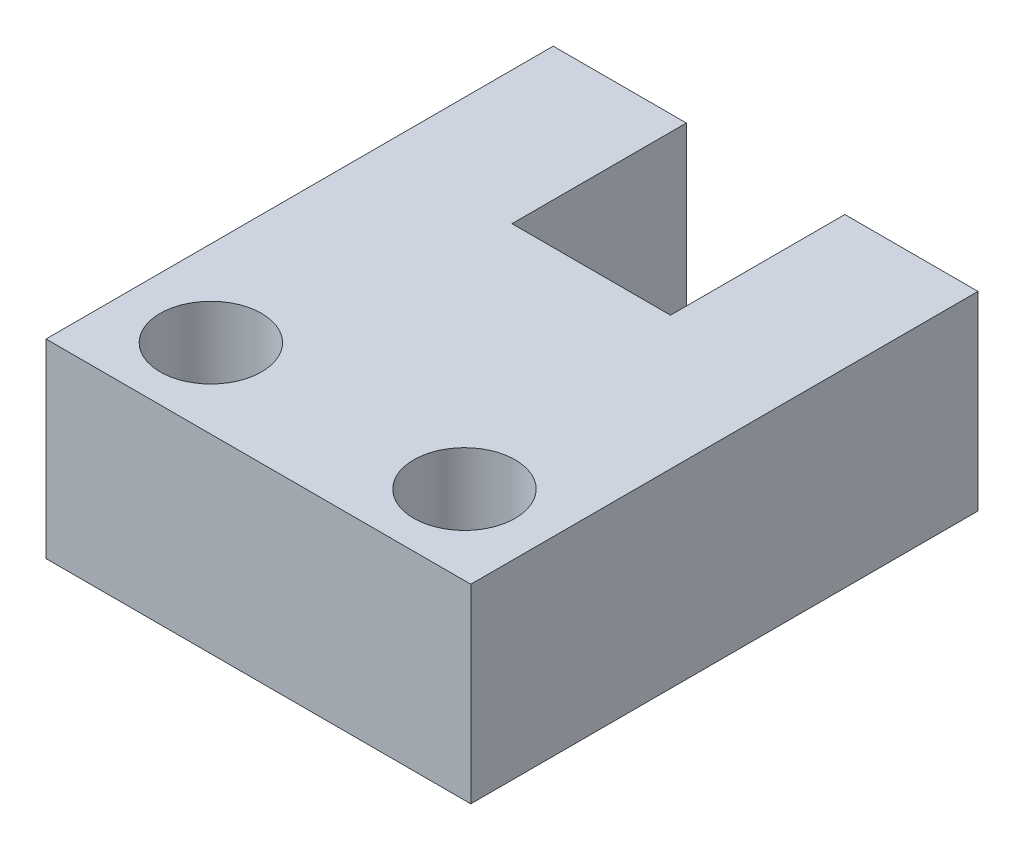
ISO-10303-21;
HEADER;
FILE_DESCRIPTION(('STEP AP214'),'2;1');
FILE_NAME('part.step','',(''),(''),'','','');
FILE_SCHEMA(('AUTOMOTIVE_DESIGN { 1 0 10303 214 1 1 1 1 }'));
ENDSEC;
DATA;
#1=APPLICATION_CONTEXT('core data for automotive mechanical design processes');
#2=APPLICATION_PROTOCOL_DEFINITION('international standard','automotive_design',2000,#1);
#3=PRODUCT_CONTEXT('',#1,'mechanical');
#4=PRODUCT('Part','Part','',(#3));
#5=PRODUCT_RELATED_PRODUCT_CATEGORY('part','',(#4));
#6=PRODUCT_DEFINITION_FORMATION('','',#4);
#7=PRODUCT_DEFINITION_CONTEXT('part definition',#1,'design');
#8=PRODUCT_DEFINITION('design','',#6,#7);
#9=PRODUCT_DEFINITION_SHAPE('','',#8);
#10=(LENGTH_UNIT() NAMED_UNIT(*) SI_UNIT(.MILLI.,.METRE.));
#11=(NAMED_UNIT(*) PLANE_ANGLE_UNIT() SI_UNIT($,.RADIAN.));
#12=(NAMED_UNIT(*) SI_UNIT($,.STERADIAN.) SOLID_ANGLE_UNIT());
#13=UNCERTAINTY_MEASURE_WITH_UNIT(LENGTH_MEASURE(1.E-05),#10,'distance_accuracy_value','');
#14=(GEOMETRIC_REPRESENTATION_CONTEXT(3) GLOBAL_UNCERTAINTY_ASSIGNED_CONTEXT((#13)) GLOBAL_UNIT_ASSIGNED_CONTEXT((#10,
#11,#12)) REPRESENTATION_CONTEXT('',''));
#15=CARTESIAN_POINT('',(0.,0.,0.));
#16=DIRECTION('',(0.,0.,1.));
#17=DIRECTION('',(1.,0.,0.));
#18=AXIS2_PLACEMENT_3D('',#15,#16,#17);
#19=CARTESIAN_POINT('',(0.,6.,0.));
#20=DIRECTION('',(0.,1.,0.));
#21=DIRECTION('',(0.,0.,1.));
#22=AXIS2_PLACEMENT_3D('',#19,#20,#21);
#23=PLANE('',#22);
#24=CARTESIAN_POINT('',(4.,6.,5.49999999999999));
#25=DIRECTION('',(0.,1.,0.));
#26=DIRECTION('',(0.,0.,1.));
#27=AXIS2_PLACEMENT_3D('',#24,#25,#26);
#28=CIRCLE('',#27,1.6);
#29=CARTESIAN_POINT('',(4.,6.,7.09999999999999));
#30=VERTEX_POINT('',#29);
#31=EDGE_CURVE('E140',#30,#30,#28,.T.);
#32=ORIENTED_EDGE('',*,*,#31,.F.);
#33=EDGE_LOOP('',(#32));
#34=FACE_BOUND('',#33,.T.);
#35=DIRECTION('',(0.,0.,-1.));
#36=VECTOR('',#35,1.);
#37=CARTESIAN_POINT('',(6.7,6.,-8.));
#38=LINE('',#37,#36);
#39=CARTESIAN_POINT('',(6.7,6.,8.));
#40=VERTEX_POINT('',#39);
#41=CARTESIAN_POINT('',(6.7,6.,-8.));
#42=VERTEX_POINT('',#41);
#43=EDGE_CURVE('E151',#40,#42,#38,.T.);
#44=ORIENTED_EDGE('',*,*,#43,.T.);
#45=DIRECTION('',(-1.,0.,0.));
#46=VECTOR('',#45,1.);
#47=CARTESIAN_POINT('',(2.5,6.,-8.00000000000001));
#48=LINE('',#47,#46);
#49=CARTESIAN_POINT('',(2.5,6.,-8.00000000000001));
#50=VERTEX_POINT('',#49);
#51=EDGE_CURVE('E99',#42,#50,#48,.T.);
#52=ORIENTED_EDGE('',*,*,#51,.T.);
#53=DIRECTION('',(0.,0.,1.));
#54=VECTOR('',#53,1.);
#55=CARTESIAN_POINT('',(2.5,6.,-8.00000000000001));
#56=LINE('',#55,#54);
#57=CARTESIAN_POINT('',(2.5,6.,-2.50000000000001));
#58=VERTEX_POINT('',#57);
#59=EDGE_CURVE('E166',#50,#58,#56,.T.);
#60=ORIENTED_EDGE('',*,*,#59,.T.);
#61=DIRECTION('',(-1.,0.,0.));
#62=VECTOR('',#61,1.);
#63=CARTESIAN_POINT('',(2.5,6.,-2.50000000000001));
#64=LINE('',#63,#62);
#65=CARTESIAN_POINT('',(-2.5,6.,-2.50000000000001));
#66=VERTEX_POINT('',#65);
#67=EDGE_CURVE('E179',#58,#66,#64,.T.);
#68=ORIENTED_EDGE('',*,*,#67,.T.);
#69=DIRECTION('',(0.,0.,-1.));
#70=VECTOR('',#69,1.);
#71=CARTESIAN_POINT('',(-2.5,6.,-8.00000000000001));
#72=LINE('',#71,#70);
#73=CARTESIAN_POINT('',(-2.5,6.,-8.00000000000001));
#74=VERTEX_POINT('',#73);
#75=EDGE_CURVE('E118',#66,#74,#72,.T.);
#76=ORIENTED_EDGE('',*,*,#75,.T.);
#77=DIRECTION('',(-1.,0.,0.));
#78=VECTOR('',#77,1.);
#79=CARTESIAN_POINT('',(-6.7,6.,-8.));
#80=LINE('',#79,#78);
#81=CARTESIAN_POINT('',(-6.7,6.,-8.));
#82=VERTEX_POINT('',#81);
#83=EDGE_CURVE('E112',#74,#82,#80,.T.);
#84=ORIENTED_EDGE('',*,*,#83,.T.);
#85=DIRECTION('',(0.,0.,1.));
#86=VECTOR('',#85,1.);
#87=CARTESIAN_POINT('',(-6.7,6.,-8.));
#88=LINE('',#87,#86);
#89=CARTESIAN_POINT('',(-6.7,6.,8.));
#90=VERTEX_POINT('',#89);
#91=EDGE_CURVE('E116',#82,#90,#88,.T.);
#92=ORIENTED_EDGE('',*,*,#91,.T.);
#93=DIRECTION('',(1.,0.,0.));
#94=VECTOR('',#93,1.);
#95=CARTESIAN_POINT('',(-6.7,6.,8.));
#96=LINE('',#95,#94);
#97=EDGE_CURVE('E56',#90,#40,#96,.T.);
#98=ORIENTED_EDGE('',*,*,#97,.T.);
#99=EDGE_LOOP('',(#44,#52,#60,#68,#76,#84,#92,#98));
#100=FACE_BOUND('',#99,.T.);
#101=CARTESIAN_POINT('',(-4.,6.,5.49999999999999));
#102=DIRECTION('',(0.,1.,0.));
#103=DIRECTION('',(0.,0.,-1.));
#104=AXIS2_PLACEMENT_3D('',#101,#102,#103);
#105=CIRCLE('',#104,1.6);
#106=CARTESIAN_POINT('',(-4.,6.,3.89999999999999));
#107=VERTEX_POINT('',#106);
#108=EDGE_CURVE('E188',#107,#107,#105,.T.);
#109=ORIENTED_EDGE('',*,*,#108,.F.);
#110=EDGE_LOOP('',(#109));
#111=FACE_BOUND('',#110,.T.);
#112=ADVANCED_FACE('F39',(#34,#100,#111),#23,.T.);
#113=CARTESIAN_POINT('',(0.,0.,0.));
#114=DIRECTION('',(0.,1.,0.));
#115=DIRECTION('',(0.,0.,1.));
#116=AXIS2_PLACEMENT_3D('',#113,#114,#115);
#117=PLANE('',#116);
#118=DIRECTION('',(0.,0.,-1.));
#119=VECTOR('',#118,1.);
#120=CARTESIAN_POINT('',(6.7,0.,-8.));
#121=LINE('',#120,#119);
#122=CARTESIAN_POINT('',(6.7,0.,8.));
#123=VERTEX_POINT('',#122);
#124=CARTESIAN_POINT('',(6.7,0.,-8.));
#125=VERTEX_POINT('',#124);
#126=EDGE_CURVE('E136',#123,#125,#121,.T.);
#127=ORIENTED_EDGE('',*,*,#126,.F.);
#128=DIRECTION('',(1.,0.,0.));
#129=VECTOR('',#128,1.);
#130=CARTESIAN_POINT('',(-6.7,0.,8.));
#131=LINE('',#130,#129);
#132=CARTESIAN_POINT('',(-6.7,0.,8.));
#133=VERTEX_POINT('',#132);
#134=EDGE_CURVE('E91',#133,#123,#131,.T.);
#135=ORIENTED_EDGE('',*,*,#134,.F.);
#136=DIRECTION('',(0.,0.,1.));
#137=VECTOR('',#136,1.);
#138=CARTESIAN_POINT('',(-6.7,0.,-8.));
#139=LINE('',#138,#137);
#140=CARTESIAN_POINT('',(-6.7,0.,-8.));
#141=VERTEX_POINT('',#140);
#142=EDGE_CURVE('E85',#141,#133,#139,.T.);
#143=ORIENTED_EDGE('',*,*,#142,.F.);
#144=DIRECTION('',(-1.,0.,0.));
#145=VECTOR('',#144,1.);
#146=CARTESIAN_POINT('',(-6.7,0.,-8.));
#147=LINE('',#146,#145);
#148=CARTESIAN_POINT('',(-2.5,0.,-8.00000000000001));
#149=VERTEX_POINT('',#148);
#150=EDGE_CURVE('E126',#149,#141,#147,.T.);
#151=ORIENTED_EDGE('',*,*,#150,.F.);
#152=DIRECTION('',(0.,0.,-1.));
#153=VECTOR('',#152,1.);
#154=CARTESIAN_POINT('',(-2.5,0.,-8.00000000000001));
#155=LINE('',#154,#153);
#156=CARTESIAN_POINT('',(-2.5,0.,-2.50000000000001));
#157=VERTEX_POINT('',#156);
#158=EDGE_CURVE('E146',#157,#149,#155,.T.);
#159=ORIENTED_EDGE('',*,*,#158,.F.);
#160=DIRECTION('',(-1.,0.,0.));
#161=VECTOR('',#160,1.);
#162=CARTESIAN_POINT('',(2.5,0.,-2.50000000000001));
#163=LINE('',#162,#161);
#164=CARTESIAN_POINT('',(2.5,0.,-2.50000000000001));
#165=VERTEX_POINT('',#164);
#166=EDGE_CURVE('E144',#165,#157,#163,.T.);
#167=ORIENTED_EDGE('',*,*,#166,.F.);
#168=DIRECTION('',(0.,0.,1.));
#169=VECTOR('',#168,1.);
#170=CARTESIAN_POINT('',(2.5,0.,-8.00000000000001));
#171=LINE('',#170,#169);
#172=CARTESIAN_POINT('',(2.5,0.,-8.00000000000001));
#173=VERTEX_POINT('',#172);
#174=EDGE_CURVE('E142',#173,#165,#171,.T.);
#175=ORIENTED_EDGE('',*,*,#174,.F.);
#176=DIRECTION('',(-1.,0.,0.));
#177=VECTOR('',#176,1.);
#178=CARTESIAN_POINT('',(2.5,0.,-8.00000000000001));
#179=LINE('',#178,#177);
#180=EDGE_CURVE('E139',#125,#173,#179,.T.);
#181=ORIENTED_EDGE('',*,*,#180,.F.);
#182=EDGE_LOOP('',(#127,#135,#143,#151,#159,#167,#175,#181));
#183=FACE_BOUND('',#182,.T.);
#184=CARTESIAN_POINT('',(4.,0.,5.49999999999999));
#185=DIRECTION('',(0.,1.,0.));
#186=DIRECTION('',(0.,0.,1.));
#187=AXIS2_PLACEMENT_3D('',#184,#185,#186);
#188=CIRCLE('',#187,1.6);
#189=CARTESIAN_POINT('',(4.,0.,7.09999999999999));
#190=VERTEX_POINT('',#189);
#191=EDGE_CURVE('E185',#190,#190,#188,.T.);
#192=ORIENTED_EDGE('',*,*,#191,.T.);
#193=EDGE_LOOP('',(#192));
#194=FACE_BOUND('',#193,.T.);
#195=CARTESIAN_POINT('',(-4.,0.,5.49999999999999));
#196=DIRECTION('',(0.,1.,0.));
#197=DIRECTION('',(0.,0.,-1.));
#198=AXIS2_PLACEMENT_3D('',#195,#196,#197);
#199=CIRCLE('',#198,1.6);
#200=CARTESIAN_POINT('',(-4.,0.,3.89999999999999));
#201=VERTEX_POINT('',#200);
#202=EDGE_CURVE('E191',#201,#201,#199,.T.);
#203=ORIENTED_EDGE('',*,*,#202,.T.);
#204=EDGE_LOOP('',(#203));
#205=FACE_BOUND('',#204,.T.);
#206=ADVANCED_FACE('F170',(#183,#194,#205),#117,.F.);
#207=CARTESIAN_POINT('',(6.7,6.,-8.));
#208=DIRECTION('',(-1.,0.,0.));
#209=DIRECTION('',(0.,0.,1.));
#210=AXIS2_PLACEMENT_3D('',#207,#208,#209);
#211=PLANE('',#210);
#212=ORIENTED_EDGE('',*,*,#126,.T.);
#213=DIRECTION('',(0.,-1.,0.));
#214=VECTOR('',#213,1.);
#215=CARTESIAN_POINT('',(6.7,6.,-8.));
#216=LINE('',#215,#214);
#217=EDGE_CURVE('E11',#42,#125,#216,.T.);
#218=ORIENTED_EDGE('',*,*,#217,.F.);
#219=ORIENTED_EDGE('',*,*,#43,.F.);
#220=DIRECTION('',(0.,-1.,0.));
#221=VECTOR('',#220,1.);
#222=CARTESIAN_POINT('',(6.7,6.,8.));
#223=LINE('',#222,#221);
#224=EDGE_CURVE('E132',#40,#123,#223,.T.);
#225=ORIENTED_EDGE('',*,*,#224,.T.);
#226=EDGE_LOOP('',(#212,#218,#219,#225));
#227=FACE_BOUND('',#226,.T.);
#228=ADVANCED_FACE('F41',(#227),#211,.F.);
#229=CARTESIAN_POINT('',(2.5,6.,-8.00000000000001));
#230=DIRECTION('',(0.,0.,1.));
#231=DIRECTION('',(1.,0.,0.));
#232=AXIS2_PLACEMENT_3D('',#229,#230,#231);
#233=PLANE('',#232);
#234=ORIENTED_EDGE('',*,*,#180,.T.);
#235=DIRECTION('',(0.,-1.,0.));
#236=VECTOR('',#235,1.);
#237=CARTESIAN_POINT('',(2.5,6.,-8.00000000000001));
#238=LINE('',#237,#236);
#239=EDGE_CURVE('E48',#50,#173,#238,.T.);
#240=ORIENTED_EDGE('',*,*,#239,.F.);
#241=ORIENTED_EDGE('',*,*,#51,.F.);
#242=ORIENTED_EDGE('',*,*,#217,.T.);
#243=EDGE_LOOP('',(#234,#240,#241,#242));
#244=FACE_BOUND('',#243,.T.);
#245=ADVANCED_FACE('F223',(#244),#233,.F.);
#246=CARTESIAN_POINT('',(2.5,6.,-8.00000000000001));
#247=DIRECTION('',(1.,0.,0.));
#248=DIRECTION('',(0.,0.,-1.));
#249=AXIS2_PLACEMENT_3D('',#246,#247,#248);
#250=PLANE('',#249);
#251=ORIENTED_EDGE('',*,*,#174,.T.);
#252=DIRECTION('',(0.,-1.,0.));
#253=VECTOR('',#252,1.);
#254=CARTESIAN_POINT('',(2.5,6.,-2.50000000000001));
#255=LINE('',#254,#253);
#256=EDGE_CURVE('E158',#58,#165,#255,.T.);
#257=ORIENTED_EDGE('',*,*,#256,.F.);
#258=ORIENTED_EDGE('',*,*,#59,.F.);
#259=ORIENTED_EDGE('',*,*,#239,.T.);
#260=EDGE_LOOP('',(#251,#257,#258,#259));
#261=FACE_BOUND('',#260,.T.);
#262=ADVANCED_FACE('F164',(#261),#250,.F.);
#263=CARTESIAN_POINT('',(2.5,6.,-2.50000000000001));
#264=DIRECTION('',(0.,0.,1.));
#265=DIRECTION('',(1.,0.,0.));
#266=AXIS2_PLACEMENT_3D('',#263,#264,#265);
#267=PLANE('',#266);
#268=ORIENTED_EDGE('',*,*,#166,.T.);
#269=DIRECTION('',(0.,-1.,0.));
#270=VECTOR('',#269,1.);
#271=CARTESIAN_POINT('',(-2.5,6.,-2.50000000000001));
#272=LINE('',#271,#270);
#273=EDGE_CURVE('E155',#66,#157,#272,.T.);
#274=ORIENTED_EDGE('',*,*,#273,.F.);
#275=ORIENTED_EDGE('',*,*,#67,.F.);
#276=ORIENTED_EDGE('',*,*,#256,.T.);
#277=EDGE_LOOP('',(#268,#274,#275,#276));
#278=FACE_BOUND('',#277,.T.);
#279=ADVANCED_FACE('F175',(#278),#267,.F.);
#280=CARTESIAN_POINT('',(-2.5,6.,-8.00000000000001));
#281=DIRECTION('',(-1.,0.,0.));
#282=DIRECTION('',(0.,0.,1.));
#283=AXIS2_PLACEMENT_3D('',#280,#281,#282);
#284=PLANE('',#283);
#285=ORIENTED_EDGE('',*,*,#158,.T.);
#286=DIRECTION('',(0.,-1.,0.));
#287=VECTOR('',#286,1.);
#288=CARTESIAN_POINT('',(-2.5,6.,-8.00000000000001));
#289=LINE('',#288,#287);
#290=EDGE_CURVE('E127',#74,#149,#289,.T.);
#291=ORIENTED_EDGE('',*,*,#290,.F.);
#292=ORIENTED_EDGE('',*,*,#75,.F.);
#293=ORIENTED_EDGE('',*,*,#273,.T.);
#294=EDGE_LOOP('',(#285,#291,#292,#293));
#295=FACE_BOUND('',#294,.T.);
#296=ADVANCED_FACE('F178',(#295),#284,.F.);
#297=CARTESIAN_POINT('',(-6.7,6.,-8.));
#298=DIRECTION('',(0.,0.,1.));
#299=DIRECTION('',(1.,0.,0.));
#300=AXIS2_PLACEMENT_3D('',#297,#298,#299);
#301=PLANE('',#300);
#302=ORIENTED_EDGE('',*,*,#150,.T.);
#303=DIRECTION('',(0.,-1.,0.));
#304=VECTOR('',#303,1.);
#305=CARTESIAN_POINT('',(-6.7,6.,-8.));
#306=LINE('',#305,#304);
#307=EDGE_CURVE('E123',#82,#141,#306,.T.);
#308=ORIENTED_EDGE('',*,*,#307,.F.);
#309=ORIENTED_EDGE('',*,*,#83,.F.);
#310=ORIENTED_EDGE('',*,*,#290,.T.);
#311=EDGE_LOOP('',(#302,#308,#309,#310));
#312=FACE_BOUND('',#311,.T.);
#313=ADVANCED_FACE('F124',(#312),#301,.F.);
#314=CARTESIAN_POINT('',(-6.7,6.,-8.));
#315=DIRECTION('',(1.,0.,0.));
#316=DIRECTION('',(0.,0.,-1.));
#317=AXIS2_PLACEMENT_3D('',#314,#315,#316);
#318=PLANE('',#317);
#319=ORIENTED_EDGE('',*,*,#142,.T.);
#320=DIRECTION('',(0.,-1.,0.));
#321=VECTOR('',#320,1.);
#322=CARTESIAN_POINT('',(-6.7,6.,8.));
#323=LINE('',#322,#321);
#324=EDGE_CURVE('E128',#90,#133,#323,.T.);
#325=ORIENTED_EDGE('',*,*,#324,.F.);
#326=ORIENTED_EDGE('',*,*,#91,.F.);
#327=ORIENTED_EDGE('',*,*,#307,.T.);
#328=EDGE_LOOP('',(#319,#325,#326,#327));
#329=FACE_BOUND('',#328,.T.);
#330=ADVANCED_FACE('F130',(#329),#318,.F.);
#331=CARTESIAN_POINT('',(-6.7,6.,8.));
#332=DIRECTION('',(0.,0.,-1.));
#333=DIRECTION('',(-1.,0.,0.));
#334=AXIS2_PLACEMENT_3D('',#331,#332,#333);
#335=PLANE('',#334);
#336=ORIENTED_EDGE('',*,*,#134,.T.);
#337=ORIENTED_EDGE('',*,*,#224,.F.);
#338=ORIENTED_EDGE('',*,*,#97,.F.);
#339=ORIENTED_EDGE('',*,*,#324,.T.);
#340=EDGE_LOOP('',(#336,#337,#338,#339));
#341=FACE_BOUND('',#340,.T.);
#342=ADVANCED_FACE('F211',(#341),#335,.F.);
#343=CARTESIAN_POINT('',(4.,6.,5.49999999999999));
#344=DIRECTION('',(0.,-1.,0.));
#345=DIRECTION('',(0.,0.,-1.));
#346=AXIS2_PLACEMENT_3D('',#343,#344,#345);
#347=CYLINDRICAL_SURFACE('',#346,1.6);
#348=ORIENTED_EDGE('',*,*,#31,.T.);
#349=EDGE_LOOP('',(#348));
#350=FACE_BOUND('',#349,.T.);
#351=ORIENTED_EDGE('',*,*,#191,.F.);
#352=EDGE_LOOP('',(#351));
#353=FACE_BOUND('',#352,.T.);
#354=ADVANCED_FACE('F208',(#350,#353),#347,.F.);
#355=CARTESIAN_POINT('',(-4.,6.,5.49999999999999));
#356=DIRECTION('',(0.,-1.,0.));
#357=DIRECTION('',(0.,0.,-1.));
#358=AXIS2_PLACEMENT_3D('',#355,#356,#357);
#359=CYLINDRICAL_SURFACE('',#358,1.6);
#360=ORIENTED_EDGE('',*,*,#108,.T.);
#361=EDGE_LOOP('',(#360));
#362=FACE_BOUND('',#361,.T.);
#363=ORIENTED_EDGE('',*,*,#202,.F.);
#364=EDGE_LOOP('',(#363));
#365=FACE_BOUND('',#364,.T.);
#366=ADVANCED_FACE('F197',(#362,#365),#359,.F.);
#367=CLOSED_SHELL('',(#112,#206,#228,#245,#262,#279,#296,#313,#330,#342,#354,#366));
#368=MANIFOLD_SOLID_BREP('B2',#367);
#369=ADVANCED_BREP_SHAPE_REPRESENTATION('',(#18,#368),#14);
#370=SHAPE_DEFINITION_REPRESENTATION(#9,#369);
ENDSEC;
END-ISO-10303-21;
